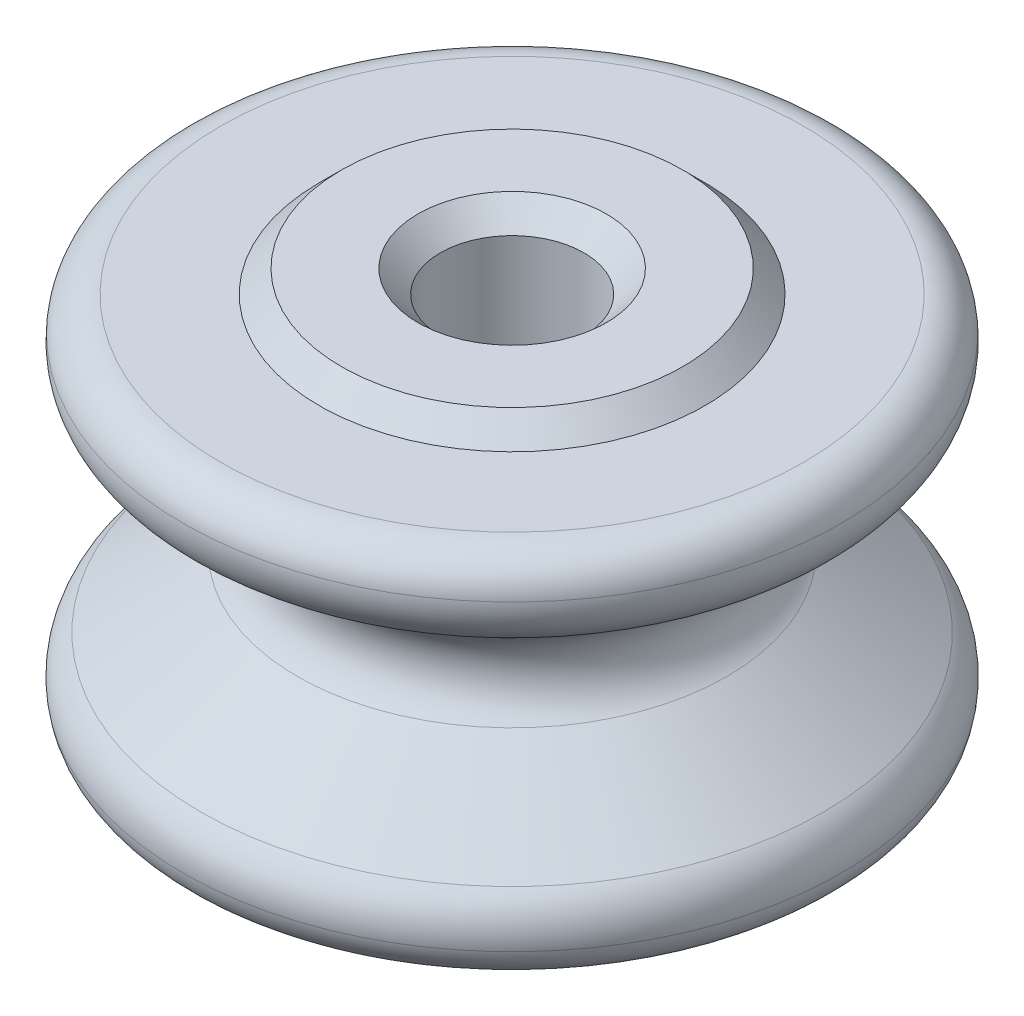
ISO-10303-21;
HEADER;
FILE_DESCRIPTION(('STEP AP214'),'2;1');
FILE_NAME('part.step','',(''),(''),'','','');
FILE_SCHEMA(('AUTOMOTIVE_DESIGN { 1 0 10303 214 1 1 1 1 }'));
ENDSEC;
DATA;
#1=APPLICATION_CONTEXT('core data for automotive mechanical design processes');
#2=APPLICATION_PROTOCOL_DEFINITION('international standard','automotive_design',2000,#1);
#3=PRODUCT_CONTEXT('',#1,'mechanical');
#4=PRODUCT('Part','Part','',(#3));
#5=PRODUCT_RELATED_PRODUCT_CATEGORY('part','',(#4));
#6=PRODUCT_DEFINITION_FORMATION('','',#4);
#7=PRODUCT_DEFINITION_CONTEXT('part definition',#1,'design');
#8=PRODUCT_DEFINITION('design','',#6,#7);
#9=PRODUCT_DEFINITION_SHAPE('','',#8);
#10=(LENGTH_UNIT() NAMED_UNIT(*) SI_UNIT(.MILLI.,.METRE.));
#11=(NAMED_UNIT(*) PLANE_ANGLE_UNIT() SI_UNIT($,.RADIAN.));
#12=(NAMED_UNIT(*) SI_UNIT($,.STERADIAN.) SOLID_ANGLE_UNIT());
#13=UNCERTAINTY_MEASURE_WITH_UNIT(LENGTH_MEASURE(1.E-05),#10,'distance_accuracy_value','');
#14=(GEOMETRIC_REPRESENTATION_CONTEXT(3) GLOBAL_UNCERTAINTY_ASSIGNED_CONTEXT((#13)) GLOBAL_UNIT_ASSIGNED_CONTEXT((#10,
#11,#12)) REPRESENTATION_CONTEXT('',''));
#15=CARTESIAN_POINT('',(0.,0.,0.));
#16=DIRECTION('',(0.,0.,1.));
#17=DIRECTION('',(1.,0.,0.));
#18=AXIS2_PLACEMENT_3D('',#15,#16,#17);
#19=CARTESIAN_POINT('',(-3.2,-1.7567744475828,0.));
#20=DIRECTION('',(0.,1.,0.));
#21=DIRECTION('',(-1.,0.,0.));
#22=AXIS2_PLACEMENT_3D('',#19,#20,#21);
#23=TOROIDAL_SURFACE('',#22,12.5207069120845,2.16796429408765);
#24=CARTESIAN_POINT('',(-3.2,-3.45364653594441,0.));
#25=DIRECTION('',(0.,1.,0.));
#26=DIRECTION('',(-1.,0.,0.));
#27=AXIS2_PLACEMENT_3D('',#24,#25,#26);
#28=CIRCLE('',#27,13.8700379671553);
#29=CARTESIAN_POINT('',(-17.0700379671553,-3.45364653594441,0.));
#30=VERTEX_POINT('',#29);
#31=EDGE_CURVE('E81',#30,#30,#28,.T.);
#32=ORIENTED_EDGE('',*,*,#31,.T.);
#33=EDGE_LOOP('',(#32));
#34=FACE_BOUND('',#33,.T.);
#35=CARTESIAN_POINT('',(-3.2,-1.50171287764168,0.));
#36=DIRECTION('',(0.,1.,0.));
#37=DIRECTION('',(-1.,0.,0.));
#38=AXIS2_PLACEMENT_3D('',#35,#36,#37);
#39=CIRCLE('',#38,14.6736148933922);
#40=CARTESIAN_POINT('',(-17.8736148933922,-1.50171287764168,0.));
#41=VERTEX_POINT('',#40);
#42=EDGE_CURVE('E10',#41,#41,#39,.T.);
#43=ORIENTED_EDGE('',*,*,#42,.F.);
#44=EDGE_LOOP('',(#43));
#45=FACE_BOUND('',#44,.T.);
#46=ADVANCED_FACE('F35',(#34,#45),#23,.T.);
#47=CARTESIAN_POINT('',(-3.2,-1.70194744228374,0.));
#48=DIRECTION('',(0.,1.,0.));
#49=DIRECTION('',(-1.,0.,0.));
#50=AXIS2_PLACEMENT_3D('',#47,#48,#49);
#51=TOROIDAL_SURFACE('',#50,12.983487319681,1.70194744228377);
#52=ORIENTED_EDGE('',*,*,#42,.T.);
#53=EDGE_LOOP('',(#52));
#54=FACE_BOUND('',#53,.T.);
#55=CARTESIAN_POINT('',(-3.2,0.,0.));
#56=DIRECTION('',(0.,1.,0.));
#57=DIRECTION('',(-1.,0.,0.));
#58=AXIS2_PLACEMENT_3D('',#55,#56,#57);
#59=CIRCLE('',#58,12.983487319681);
#60=CARTESIAN_POINT('',(-16.183487319681,0.,0.));
#61=VERTEX_POINT('',#60);
#62=EDGE_CURVE('E41',#61,#61,#59,.T.);
#63=ORIENTED_EDGE('',*,*,#62,.F.);
#64=EDGE_LOOP('',(#63));
#65=FACE_BOUND('',#64,.T.);
#66=ADVANCED_FACE('F111',(#54,#65),#51,.T.);
#67=CARTESIAN_POINT('',(0.,0.,0.));
#68=DIRECTION('',(0.,1.,0.));
#69=DIRECTION('',(-1.,0.,0.));
#70=AXIS2_PLACEMENT_3D('',#67,#68,#69);
#71=PLANE('',#70);
#72=ORIENTED_EDGE('',*,*,#62,.T.);
#73=EDGE_LOOP('',(#72));
#74=FACE_BOUND('',#73,.T.);
#75=CARTESIAN_POINT('',(-3.2,0.,0.));
#76=DIRECTION('',(0.,1.,0.));
#77=DIRECTION('',(-1.,0.,0.));
#78=AXIS2_PLACEMENT_3D('',#75,#76,#77);
#79=CIRCLE('',#78,8.6);
#80=CARTESIAN_POINT('',(-11.8,0.,0.));
#81=VERTEX_POINT('',#80);
#82=EDGE_CURVE('E45',#81,#81,#79,.T.);
#83=ORIENTED_EDGE('',*,*,#82,.F.);
#84=EDGE_LOOP('',(#83));
#85=FACE_BOUND('',#84,.T.);
#86=ADVANCED_FACE('F116',(#74,#85),#71,.T.);
#87=CARTESIAN_POINT('',(-3.2,1.00000000000003,0.));
#88=DIRECTION('',(0.,-1.,0.));
#89=DIRECTION('',(1.,0.,0.));
#90=AXIS2_PLACEMENT_3D('',#87,#88,#89);
#91=CONICAL_SURFACE('',#90,7.6,0.785398163397448);
#92=ORIENTED_EDGE('',*,*,#82,.T.);
#93=EDGE_LOOP('',(#92));
#94=FACE_BOUND('',#93,.T.);
#95=CARTESIAN_POINT('',(-3.2,1.00000000000003,0.));
#96=DIRECTION('',(0.,1.,0.));
#97=DIRECTION('',(-1.,0.,0.));
#98=AXIS2_PLACEMENT_3D('',#95,#96,#97);
#99=CIRCLE('',#98,7.6);
#100=CARTESIAN_POINT('',(-10.8,1.00000000000003,0.));
#101=VERTEX_POINT('',#100);
#102=EDGE_CURVE('E49',#101,#101,#99,.T.);
#103=ORIENTED_EDGE('',*,*,#102,.F.);
#104=EDGE_LOOP('',(#103));
#105=FACE_BOUND('',#104,.T.);
#106=ADVANCED_FACE('F107',(#94,#105),#91,.T.);
#107=CARTESIAN_POINT('',(0.,1.00000000000001,0.));
#108=DIRECTION('',(0.,1.,0.));
#109=DIRECTION('',(-1.,0.,0.));
#110=AXIS2_PLACEMENT_3D('',#107,#108,#109);
#111=PLANE('',#110);
#112=ORIENTED_EDGE('',*,*,#102,.T.);
#113=EDGE_LOOP('',(#112));
#114=FACE_BOUND('',#113,.T.);
#115=CARTESIAN_POINT('',(-3.2,1.,0.));
#116=DIRECTION('',(0.,1.,0.));
#117=DIRECTION('',(-1.,0.,0.));
#118=AXIS2_PLACEMENT_3D('',#115,#116,#117);
#119=CIRCLE('',#118,4.2);
#120=CARTESIAN_POINT('',(-7.4,1.,0.));
#121=VERTEX_POINT('',#120);
#122=EDGE_CURVE('E54',#121,#121,#119,.T.);
#123=ORIENTED_EDGE('',*,*,#122,.F.);
#124=EDGE_LOOP('',(#123));
#125=FACE_BOUND('',#124,.T.);
#126=ADVANCED_FACE('F97',(#114,#125),#111,.T.);
#127=CARTESIAN_POINT('',(-3.2,0.,0.));
#128=DIRECTION('',(0.,1.,0.));
#129=DIRECTION('',(-1.,0.,0.));
#130=AXIS2_PLACEMENT_3D('',#127,#128,#129);
#131=CONICAL_SURFACE('',#130,3.2,0.785398163397448);
#132=ORIENTED_EDGE('',*,*,#122,.T.);
#133=EDGE_LOOP('',(#132));
#134=FACE_BOUND('',#133,.T.);
#135=CARTESIAN_POINT('',(-3.2,0.,0.));
#136=DIRECTION('',(0.,1.,0.));
#137=DIRECTION('',(-1.,0.,0.));
#138=AXIS2_PLACEMENT_3D('',#135,#136,#137);
#139=CIRCLE('',#138,3.20000000000002);
#140=CARTESIAN_POINT('',(-6.40000000000002,0.,0.));
#141=VERTEX_POINT('',#140);
#142=EDGE_CURVE('E87',#141,#141,#139,.T.);
#143=ORIENTED_EDGE('',*,*,#142,.F.);
#144=EDGE_LOOP('',(#143));
#145=FACE_BOUND('',#144,.T.);
#146=ADVANCED_FACE('F94',(#134,#145),#131,.F.);
#147=CARTESIAN_POINT('',(-3.2,-16.5000000000012,0.));
#148=DIRECTION('',(0.,-1.,0.));
#149=DIRECTION('',(1.,0.,0.));
#150=AXIS2_PLACEMENT_3D('',#147,#148,#149);
#151=CONICAL_SURFACE('',#150,3.20000000000001,0.78539816339745);
#152=CARTESIAN_POINT('',(-3.2,-17.5000000000012,0.));
#153=DIRECTION('',(0.,1.,0.));
#154=DIRECTION('',(-1.,0.,0.));
#155=AXIS2_PLACEMENT_3D('',#152,#153,#154);
#156=CIRCLE('',#155,4.20000000000001);
#157=CARTESIAN_POINT('',(-7.40000000000001,-17.5000000000012,0.));
#158=VERTEX_POINT('',#157);
#159=EDGE_CURVE('E57',#158,#158,#156,.T.);
#160=ORIENTED_EDGE('',*,*,#159,.F.);
#161=EDGE_LOOP('',(#160));
#162=FACE_BOUND('',#161,.T.);
#163=CARTESIAN_POINT('',(-3.2,-16.5000000000013,0.));
#164=DIRECTION('',(0.,-1.,0.));
#165=DIRECTION('',(1.,0.,0.));
#166=AXIS2_PLACEMENT_3D('',#163,#164,#165);
#167=CIRCLE('',#166,3.20000000000002);
#168=CARTESIAN_POINT('',(0.,-16.5000000000013,0.));
#169=VERTEX_POINT('',#168);
#170=EDGE_CURVE('E84',#169,#169,#167,.F.);
#171=ORIENTED_EDGE('',*,*,#170,.T.);
#172=EDGE_LOOP('',(#171));
#173=FACE_BOUND('',#172,.T.);
#174=ADVANCED_FACE('F96',(#162,#173),#151,.F.);
#175=CARTESIAN_POINT('',(1.25002132827748E-13,-17.5000000000012,0.));
#176=DIRECTION('',(0.,1.,0.));
#177=DIRECTION('',(-1.,0.,0.));
#178=AXIS2_PLACEMENT_3D('',#175,#176,#177);
#179=PLANE('',#178);
#180=CARTESIAN_POINT('',(-3.2,-17.5000000000012,0.));
#181=DIRECTION('',(0.,1.,0.));
#182=DIRECTION('',(-1.,0.,0.));
#183=AXIS2_PLACEMENT_3D('',#180,#181,#182);
#184=CIRCLE('',#183,7.60000000000003);
#185=CARTESIAN_POINT('',(-10.8,-17.5000000000012,0.));
#186=VERTEX_POINT('',#185);
#187=EDGE_CURVE('E60',#186,#186,#184,.T.);
#188=ORIENTED_EDGE('',*,*,#187,.F.);
#189=EDGE_LOOP('',(#188));
#190=FACE_BOUND('',#189,.T.);
#191=ORIENTED_EDGE('',*,*,#159,.T.);
#192=EDGE_LOOP('',(#191));
#193=FACE_BOUND('',#192,.T.);
#194=ADVANCED_FACE('F104',(#190,#193),#179,.F.);
#195=CARTESIAN_POINT('',(-3.2,-17.5000000000012,0.));
#196=DIRECTION('',(0.,1.,0.));
#197=DIRECTION('',(-1.,0.,0.));
#198=AXIS2_PLACEMENT_3D('',#195,#196,#197);
#199=CONICAL_SURFACE('',#198,7.60000000000003,0.785398163397447);
#200=CARTESIAN_POINT('',(-3.2,-16.5000000000012,0.));
#201=DIRECTION('',(0.,1.,0.));
#202=DIRECTION('',(-1.,0.,0.));
#203=AXIS2_PLACEMENT_3D('',#200,#201,#202);
#204=CIRCLE('',#203,8.6);
#205=CARTESIAN_POINT('',(-11.8,-16.5000000000012,0.));
#206=VERTEX_POINT('',#205);
#207=EDGE_CURVE('E63',#206,#206,#204,.T.);
#208=ORIENTED_EDGE('',*,*,#207,.F.);
#209=EDGE_LOOP('',(#208));
#210=FACE_BOUND('',#209,.T.);
#211=ORIENTED_EDGE('',*,*,#187,.T.);
#212=EDGE_LOOP('',(#211));
#213=FACE_BOUND('',#212,.T.);
#214=ADVANCED_FACE('F148',(#210,#213),#199,.T.);
#215=CARTESIAN_POINT('',(0.,-16.5000000000012,0.));
#216=DIRECTION('',(0.,1.,0.));
#217=DIRECTION('',(-1.,0.,0.));
#218=AXIS2_PLACEMENT_3D('',#215,#216,#217);
#219=PLANE('',#218);
#220=CARTESIAN_POINT('',(-3.2,-16.5000000000012,0.));
#221=DIRECTION('',(0.,1.,0.));
#222=DIRECTION('',(-1.,0.,0.));
#223=AXIS2_PLACEMENT_3D('',#220,#221,#222);
#224=CIRCLE('',#223,12.983487319681);
#225=CARTESIAN_POINT('',(-16.183487319681,-16.5000000000012,0.));
#226=VERTEX_POINT('',#225);
#227=EDGE_CURVE('E66',#226,#226,#224,.T.);
#228=ORIENTED_EDGE('',*,*,#227,.F.);
#229=EDGE_LOOP('',(#228));
#230=FACE_BOUND('',#229,.T.);
#231=ORIENTED_EDGE('',*,*,#207,.T.);
#232=EDGE_LOOP('',(#231));
#233=FACE_BOUND('',#232,.T.);
#234=ADVANCED_FACE('F144',(#230,#233),#219,.F.);
#235=CARTESIAN_POINT('',(-3.2,-14.7980525577175,0.));
#236=DIRECTION('',(0.,1.,0.));
#237=DIRECTION('',(-1.,0.,0.));
#238=AXIS2_PLACEMENT_3D('',#235,#236,#237);
#239=TOROIDAL_SURFACE('',#238,12.983487319681,1.70194744228376);
#240=CARTESIAN_POINT('',(-3.2,-14.9982871223595,0.));
#241=DIRECTION('',(0.,1.,0.));
#242=DIRECTION('',(-1.,0.,0.));
#243=AXIS2_PLACEMENT_3D('',#240,#241,#242);
#244=CIRCLE('',#243,14.6736148933922);
#245=CARTESIAN_POINT('',(-17.8736148933922,-14.9982871223595,0.));
#246=VERTEX_POINT('',#245);
#247=EDGE_CURVE('E69',#246,#246,#244,.T.);
#248=ORIENTED_EDGE('',*,*,#247,.F.);
#249=EDGE_LOOP('',(#248));
#250=FACE_BOUND('',#249,.T.);
#251=ORIENTED_EDGE('',*,*,#227,.T.);
#252=EDGE_LOOP('',(#251));
#253=FACE_BOUND('',#252,.T.);
#254=ADVANCED_FACE('F140',(#250,#253),#239,.T.);
#255=CARTESIAN_POINT('',(-3.2,-14.7432255524184,0.));
#256=DIRECTION('',(0.,1.,0.));
#257=DIRECTION('',(-1.,0.,0.));
#258=AXIS2_PLACEMENT_3D('',#255,#256,#257);
#259=TOROIDAL_SURFACE('',#258,12.5207069120845,2.16796429408765);
#260=CARTESIAN_POINT('',(-3.2,-13.0485196679453,0.));
#261=DIRECTION('',(0.,1.,0.));
#262=DIRECTION('',(-1.,0.,0.));
#263=AXIS2_PLACEMENT_3D('',#260,#261,#262);
#264=CIRCLE('',#263,13.8727576306492);
#265=CARTESIAN_POINT('',(-17.0727576306492,-13.0485196679453,0.));
#266=VERTEX_POINT('',#265);
#267=EDGE_CURVE('E72',#266,#266,#264,.T.);
#268=ORIENTED_EDGE('',*,*,#267,.F.);
#269=EDGE_LOOP('',(#268));
#270=FACE_BOUND('',#269,.T.);
#271=ORIENTED_EDGE('',*,*,#247,.T.);
#272=EDGE_LOOP('',(#271));
#273=FACE_BOUND('',#272,.T.);
#274=ADVANCED_FACE('F136',(#270,#273),#259,.T.);
#275=CARTESIAN_POINT('',(-3.2,-13.0485196679453,0.));
#276=DIRECTION('',(0.,-1.,0.));
#277=DIRECTION('',(1.,0.,0.));
#278=AXIS2_PLACEMENT_3D('',#275,#276,#277);
#279=CONICAL_SURFACE('',#278,13.8727576306492,0.949157381409635);
#280=CARTESIAN_POINT('',(-3.2,-9.96646076595718,0.));
#281=DIRECTION('',(0.,1.,0.));
#282=DIRECTION('',(-1.,0.,0.));
#283=AXIS2_PLACEMENT_3D('',#280,#281,#282);
#284=CIRCLE('',#283,9.57052645750457);
#285=CARTESIAN_POINT('',(-12.7705264575046,-9.96646076595718,0.));
#286=VERTEX_POINT('',#285);
#287=EDGE_CURVE('E75',#286,#286,#284,.T.);
#288=ORIENTED_EDGE('',*,*,#287,.F.);
#289=EDGE_LOOP('',(#288));
#290=FACE_BOUND('',#289,.T.);
#291=ORIENTED_EDGE('',*,*,#267,.T.);
#292=EDGE_LOOP('',(#291));
#293=FACE_BOUND('',#292,.T.);
#294=ADVANCED_FACE('F130',(#290,#293),#279,.T.);
#295=CARTESIAN_POINT('',(-3.2,-8.22955695129634,0.));
#296=DIRECTION('',(0.,1.,0.));
#297=DIRECTION('',(-1.,0.,0.));
#298=AXIS2_PLACEMENT_3D('',#295,#296,#297);
#299=TOROIDAL_SURFACE('',#298,10.8679216629279,2.16796429408765);
#300=ORIENTED_EDGE('',*,*,#287,.T.);
#301=EDGE_LOOP('',(#300));
#302=FACE_BOUND('',#301,.T.);
#303=CARTESIAN_POINT('',(-3.2,-6.50906187342674,0.));
#304=DIRECTION('',(0.,1.,0.));
#305=DIRECTION('',(-1.,0.,0.));
#306=AXIS2_PLACEMENT_3D('',#303,#304,#305);
#307=CIRCLE('',#306,9.54884400506793);
#308=CARTESIAN_POINT('',(-12.7488440050679,-6.50906187342674,0.));
#309=VERTEX_POINT('',#308);
#310=EDGE_CURVE('E78',#309,#309,#307,.T.);
#311=ORIENTED_EDGE('',*,*,#310,.F.);
#312=EDGE_LOOP('',(#311));
#313=FACE_BOUND('',#312,.T.);
#314=ADVANCED_FACE('F122',(#302,#313),#299,.F.);
#315=CARTESIAN_POINT('',(-3.2,-3.45364653594441,0.));
#316=DIRECTION('',(0.,1.,0.));
#317=DIRECTION('',(-1.,0.,0.));
#318=AXIS2_PLACEMENT_3D('',#315,#316,#317);
#319=CONICAL_SURFACE('',#318,13.8700379671553,0.955336707908783);
#320=ORIENTED_EDGE('',*,*,#310,.T.);
#321=EDGE_LOOP('',(#320));
#322=FACE_BOUND('',#321,.T.);
#323=ORIENTED_EDGE('',*,*,#31,.F.);
#324=EDGE_LOOP('',(#323));
#325=FACE_BOUND('',#324,.T.);
#326=ADVANCED_FACE('F120',(#322,#325),#319,.T.);
#327=CARTESIAN_POINT('',(-3.2,-19.,0.));
#328=DIRECTION('',(0.,1.,0.));
#329=DIRECTION('',(-1.,0.,0.));
#330=AXIS2_PLACEMENT_3D('',#327,#328,#329);
#331=CYLINDRICAL_SURFACE('',#330,3.20000000000002);
#332=ORIENTED_EDGE('',*,*,#142,.T.);
#333=EDGE_LOOP('',(#332));
#334=FACE_BOUND('',#333,.T.);
#335=ORIENTED_EDGE('',*,*,#170,.F.);
#336=EDGE_LOOP('',(#335));
#337=FACE_BOUND('',#336,.T.);
#338=ADVANCED_FACE('F91',(#334,#337),#331,.F.);
#339=CLOSED_SHELL('',(#46,#66,#86,#106,#126,#146,#174,#194,#214,#234,#254,#274,#294,#314,#326,#338));
#340=MANIFOLD_SOLID_BREP('B2',#339);
#341=ADVANCED_BREP_SHAPE_REPRESENTATION('',(#18,#340),#14);
#342=SHAPE_DEFINITION_REPRESENTATION(#9,#341);
ENDSEC;
END-ISO-10303-21;
